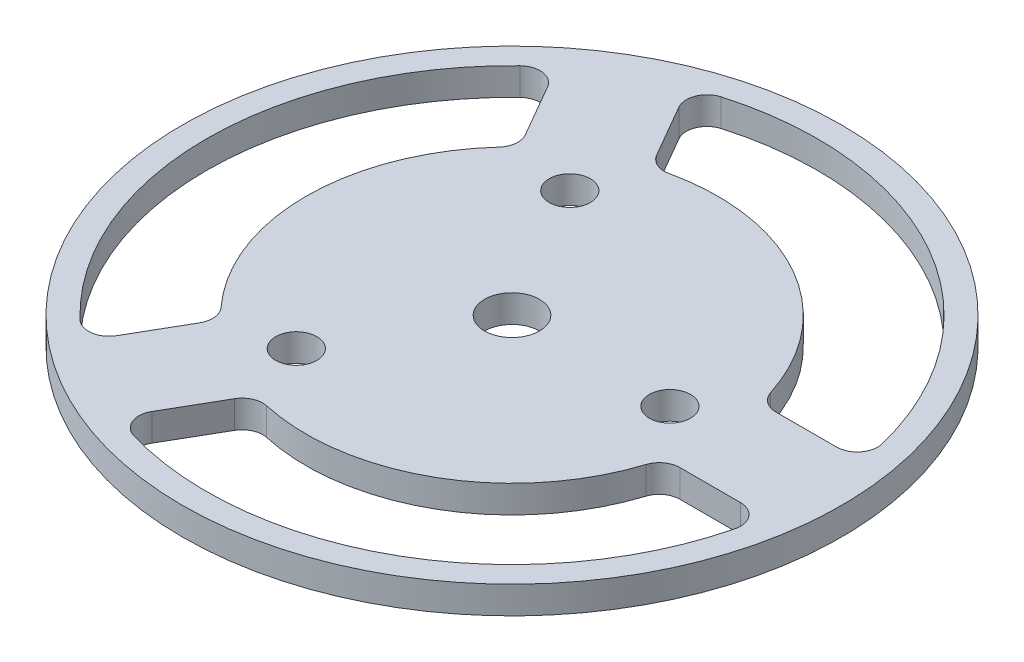
ISO-10303-21;
HEADER;
FILE_DESCRIPTION(('STEP AP214'),'2;1');
FILE_NAME('part.step','',(''),(''),'','','');
FILE_SCHEMA(('AUTOMOTIVE_DESIGN { 1 0 10303 214 1 1 1 1 }'));
ENDSEC;
DATA;
#1=APPLICATION_CONTEXT('core data for automotive mechanical design processes');
#2=APPLICATION_PROTOCOL_DEFINITION('international standard','automotive_design',2000,#1);
#3=PRODUCT_CONTEXT('',#1,'mechanical');
#4=PRODUCT('Part','Part','',(#3));
#5=PRODUCT_RELATED_PRODUCT_CATEGORY('part','',(#4));
#6=PRODUCT_DEFINITION_FORMATION('','',#4);
#7=PRODUCT_DEFINITION_CONTEXT('part definition',#1,'design');
#8=PRODUCT_DEFINITION('design','',#6,#7);
#9=PRODUCT_DEFINITION_SHAPE('','',#8);
#10=(LENGTH_UNIT() NAMED_UNIT(*) SI_UNIT(.MILLI.,.METRE.));
#11=(NAMED_UNIT(*) PLANE_ANGLE_UNIT() SI_UNIT($,.RADIAN.));
#12=(NAMED_UNIT(*) SI_UNIT($,.STERADIAN.) SOLID_ANGLE_UNIT());
#13=UNCERTAINTY_MEASURE_WITH_UNIT(LENGTH_MEASURE(1.E-05),#10,'distance_accuracy_value','');
#14=(GEOMETRIC_REPRESENTATION_CONTEXT(3) GLOBAL_UNCERTAINTY_ASSIGNED_CONTEXT((#13)) GLOBAL_UNIT_ASSIGNED_CONTEXT((#10,
#11,#12)) REPRESENTATION_CONTEXT('',''));
#15=CARTESIAN_POINT('',(0.,0.,0.));
#16=DIRECTION('',(0.,0.,1.));
#17=DIRECTION('',(1.,0.,0.));
#18=AXIS2_PLACEMENT_3D('',#15,#16,#17);
#19=CARTESIAN_POINT('',(0.,2.,0.));
#20=DIRECTION('',(0.,1.,0.));
#21=DIRECTION('',(0.,0.,-1.));
#22=AXIS2_PLACEMENT_3D('',#19,#20,#21);
#23=PLANE('',#22);
#24=CARTESIAN_POINT('',(0.,2.,0.));
#25=DIRECTION('',(0.,-1.,0.));
#26=DIRECTION('',(0.,0.,-1.));
#27=AXIS2_PLACEMENT_3D('',#24,#25,#26);
#28=CIRCLE('',#27,22.25);
#29=CARTESIAN_POINT('',(21.5943835085545,2.,5.36144578313253));
#30=VERTEX_POINT('',#29);
#31=CARTESIAN_POINT('',(-6.15404350507153,2.,21.3820075890382));
#32=VERTEX_POINT('',#31);
#33=EDGE_CURVE('E320',#30,#32,#28,.T.);
#34=ORIENTED_EDGE('',*,*,#33,.T.);
#35=CARTESIAN_POINT('',(-5.73916416765098,2.,19.9405239313502));
#36=DIRECTION('',(0.,-1.,0.));
#37=DIRECTION('',(0.,0.,-1.));
#38=AXIS2_PLACEMENT_3D('',#35,#36,#37);
#39=CIRCLE('',#38,1.5);
#40=CARTESIAN_POINT('',(-7.03820227332764,2.,19.1905239313502));
#41=VERTEX_POINT('',#40);
#42=EDGE_CURVE('E226',#41,#32,#39,.F.);
#43=ORIENTED_EDGE('',*,*,#42,.F.);
#44=DIRECTION('',(0.5,0.,-0.866025403784438));
#45=VECTOR('',#44,1.);
#46=CARTESIAN_POINT('',(-7.95540848128382,2.,20.7791716845479));
#47=LINE('',#46,#45);
#48=CARTESIAN_POINT('',(-4.83100368351267,2.,15.3675438313963));
#49=VERTEX_POINT('',#48);
#50=EDGE_CURVE('E323',#41,#49,#47,.T.);
#51=ORIENTED_EDGE('',*,*,#50,.T.);
#52=CARTESIAN_POINT('',(-3.53196557783601,2.,16.1175438313963));
#53=DIRECTION('',(0.,-1.,0.));
#54=DIRECTION('',(0.,0.,-1.));
#55=AXIS2_PLACEMENT_3D('',#52,#53,#54);
#56=CIRCLE('',#55,1.5);
#57=CARTESIAN_POINT('',(-3.21087779803273,2.,14.6523125739967));
#58=VERTEX_POINT('',#57);
#59=EDGE_CURVE('E254',#58,#49,#56,.F.);
#60=ORIENTED_EDGE('',*,*,#59,.F.);
#61=CARTESIAN_POINT('',(0.,2.,0.));
#62=DIRECTION('',(0.,1.,0.));
#63=DIRECTION('',(0.,0.,-1.));
#64=AXIS2_PLACEMENT_3D('',#61,#62,#63);
#65=CIRCLE('',#64,15.);
#66=CARTESIAN_POINT('',(14.2947138122876,2.,4.54545454545454));
#67=VERTEX_POINT('',#66);
#68=EDGE_CURVE('E326',#58,#67,#65,.T.);
#69=ORIENTED_EDGE('',*,*,#68,.T.);
#70=CARTESIAN_POINT('',(15.7241851935164,2.,5.));
#71=DIRECTION('',(0.,-1.,0.));
#72=DIRECTION('',(0.,0.,-1.));
#73=AXIS2_PLACEMENT_3D('',#70,#71,#72);
#74=CIRCLE('',#73,1.5);
#75=CARTESIAN_POINT('',(15.7241851935164,2.,3.5));
#76=VERTEX_POINT('',#75);
#77=EDGE_CURVE('E260',#76,#67,#74,.F.);
#78=ORIENTED_EDGE('',*,*,#77,.F.);
#79=DIRECTION('',(1.,0.,0.));
#80=VECTOR('',#79,1.);
#81=CARTESIAN_POINT('',(21.9729947890587,2.,3.5));
#82=LINE('',#81,#80);
#83=CARTESIAN_POINT('',(20.1385823731463,2.,3.5));
#84=VERTEX_POINT('',#83);
#85=EDGE_CURVE('E310',#76,#84,#82,.T.);
#86=ORIENTED_EDGE('',*,*,#85,.T.);
#87=CARTESIAN_POINT('',(20.1385823731463,2.,5.));
#88=DIRECTION('',(0.,-1.,0.));
#89=DIRECTION('',(0.,0.,-1.));
#90=AXIS2_PLACEMENT_3D('',#87,#88,#89);
#91=CIRCLE('',#90,1.5);
#92=EDGE_CURVE('E242',#30,#84,#91,.F.);
#93=ORIENTED_EDGE('',*,*,#92,.F.);
#94=EDGE_LOOP('',(#34,#43,#51,#60,#69,#78,#86,#93));
#95=FACE_BOUND('',#94,.T.);
#96=CARTESIAN_POINT('',(0.,2.,0.));
#97=DIRECTION('',(0.,-1.,0.));
#98=DIRECTION('',(0.,0.,-1.));
#99=AXIS2_PLACEMENT_3D('',#96,#97,#98);
#100=CIRCLE('',#99,22.25);
#101=CARTESIAN_POINT('',(-15.440340003483,2.,16.0205618059057));
#102=VERTEX_POINT('',#101);
#103=CARTESIAN_POINT('',(-15.440340003483,2.,-16.0205618059057));
#104=VERTEX_POINT('',#103);
#105=EDGE_CURVE('E319',#102,#104,#100,.T.);
#106=ORIENTED_EDGE('',*,*,#105,.T.);
#107=CARTESIAN_POINT('',(-14.3994182054954,2.,-14.9405239313502));
#108=DIRECTION('',(0.,-1.,0.));
#109=DIRECTION('',(0.,0.,-1.));
#110=AXIS2_PLACEMENT_3D('',#107,#108,#109);
#111=CIRCLE('',#110,1.5);
#112=CARTESIAN_POINT('',(-13.1003800998187,2.,-15.6905239313502));
#113=VERTEX_POINT('',#112);
#114=EDGE_CURVE('E248',#113,#104,#111,.F.);
#115=ORIENTED_EDGE('',*,*,#114,.F.);
#116=DIRECTION('',(0.499999999999999,0.,0.866025403784439));
#117=VECTOR('',#116,1.);
#118=CARTESIAN_POINT('',(-14.0175863077749,2.,-17.2791716845479));
#119=LINE('',#118,#117);
#120=CARTESIAN_POINT('',(-10.8931815100037,2.,-11.8675438313963));
#121=VERTEX_POINT('',#120);
#122=EDGE_CURVE('E302',#113,#121,#119,.T.);
#123=ORIENTED_EDGE('',*,*,#122,.T.);
#124=CARTESIAN_POINT('',(-12.1922196156804,2.,-11.1175438313963));
#125=DIRECTION('',(0.,-1.,0.));
#126=DIRECTION('',(0.,0.,-1.));
#127=AXIS2_PLACEMENT_3D('',#124,#125,#126);
#128=CIRCLE('',#127,1.5);
#129=CARTESIAN_POINT('',(-11.0838360142549,2.,-10.1068580285421));
#130=VERTEX_POINT('',#129);
#131=EDGE_CURVE('E277',#130,#121,#128,.F.);
#132=ORIENTED_EDGE('',*,*,#131,.F.);
#133=CARTESIAN_POINT('',(0.,2.,0.));
#134=DIRECTION('',(0.,1.,0.));
#135=DIRECTION('',(0.,0.,-1.));
#136=AXIS2_PLACEMENT_3D('',#133,#134,#135);
#137=CIRCLE('',#136,15.);
#138=CARTESIAN_POINT('',(-11.0838360142549,2.,10.1068580285421));
#139=VERTEX_POINT('',#138);
#140=EDGE_CURVE('E297',#130,#139,#137,.T.);
#141=ORIENTED_EDGE('',*,*,#140,.T.);
#142=CARTESIAN_POINT('',(-12.1922196156804,2.,11.1175438313963));
#143=DIRECTION('',(0.,-1.,0.));
#144=DIRECTION('',(0.,0.,-1.));
#145=AXIS2_PLACEMENT_3D('',#142,#143,#144);
#146=CIRCLE('',#145,1.5);
#147=CARTESIAN_POINT('',(-10.8931815100037,2.,11.8675438313963));
#148=VERTEX_POINT('',#147);
#149=EDGE_CURVE('E283',#148,#139,#146,.F.);
#150=ORIENTED_EDGE('',*,*,#149,.F.);
#151=DIRECTION('',(-0.499999999999998,0.,0.86602540378444));
#152=VECTOR('',#151,1.);
#153=CARTESIAN_POINT('',(-14.0175863077749,2.,17.2791716845479));
#154=LINE('',#153,#152);
#155=CARTESIAN_POINT('',(-13.1003800998187,2.,15.6905239313502));
#156=VERTEX_POINT('',#155);
#157=EDGE_CURVE('E294',#148,#156,#154,.T.);
#158=ORIENTED_EDGE('',*,*,#157,.T.);
#159=CARTESIAN_POINT('',(-14.3994182054954,2.,14.9405239313502));
#160=DIRECTION('',(0.,-1.,0.));
#161=DIRECTION('',(0.,0.,-1.));
#162=AXIS2_PLACEMENT_3D('',#159,#160,#161);
#163=CIRCLE('',#162,1.5);
#164=EDGE_CURVE('E45',#102,#156,#163,.F.);
#165=ORIENTED_EDGE('',*,*,#164,.F.);
#166=EDGE_LOOP('',(#106,#115,#123,#132,#141,#150,#158,#165));
#167=FACE_BOUND('',#166,.T.);
#168=CARTESIAN_POINT('',(0.,2.,0.));
#169=DIRECTION('',(0.,-1.,0.));
#170=DIRECTION('',(0.,0.,-1.));
#171=AXIS2_PLACEMENT_3D('',#168,#169,#170);
#172=CIRCLE('',#171,22.25);
#173=CARTESIAN_POINT('',(-6.15404350507152,2.,-21.3820075890382));
#174=VERTEX_POINT('',#173);
#175=CARTESIAN_POINT('',(21.5943835085545,2.,-5.36144578313253));
#176=VERTEX_POINT('',#175);
#177=EDGE_CURVE('E342',#174,#176,#172,.T.);
#178=ORIENTED_EDGE('',*,*,#177,.T.);
#179=CARTESIAN_POINT('',(20.1385823731463,2.,-5.));
#180=DIRECTION('',(0.,-1.,0.));
#181=DIRECTION('',(0.,0.,-1.));
#182=AXIS2_PLACEMENT_3D('',#179,#180,#181);
#183=CIRCLE('',#182,1.5);
#184=CARTESIAN_POINT('',(20.1385823731463,2.,-3.5));
#185=VERTEX_POINT('',#184);
#186=EDGE_CURVE('E271',#185,#176,#183,.F.);
#187=ORIENTED_EDGE('',*,*,#186,.F.);
#188=DIRECTION('',(-1.,0.,0.));
#189=VECTOR('',#188,1.);
#190=CARTESIAN_POINT('',(21.9729947890587,2.,-3.5));
#191=LINE('',#190,#189);
#192=CARTESIAN_POINT('',(15.7241851935164,2.,-3.5));
#193=VERTEX_POINT('',#192);
#194=EDGE_CURVE('E344',#185,#193,#191,.T.);
#195=ORIENTED_EDGE('',*,*,#194,.T.);
#196=CARTESIAN_POINT('',(15.7241851935164,2.,-5.));
#197=DIRECTION('',(0.,-1.,0.));
#198=DIRECTION('',(0.,0.,-1.));
#199=AXIS2_PLACEMENT_3D('',#196,#197,#198);
#200=CIRCLE('',#199,1.5);
#201=CARTESIAN_POINT('',(14.2947138122876,2.,-4.54545454545454));
#202=VERTEX_POINT('',#201);
#203=EDGE_CURVE('E236',#202,#193,#200,.F.);
#204=ORIENTED_EDGE('',*,*,#203,.F.);
#205=CARTESIAN_POINT('',(0.,2.,0.));
#206=DIRECTION('',(0.,1.,0.));
#207=DIRECTION('',(0.,0.,-1.));
#208=AXIS2_PLACEMENT_3D('',#205,#206,#207);
#209=CIRCLE('',#208,15.);
#210=CARTESIAN_POINT('',(-3.21087779803272,2.,-14.6523125739967));
#211=VERTEX_POINT('',#210);
#212=EDGE_CURVE('E219',#202,#211,#209,.T.);
#213=ORIENTED_EDGE('',*,*,#212,.T.);
#214=CARTESIAN_POINT('',(-3.531965577836,2.,-16.1175438313963));
#215=DIRECTION('',(0.,-1.,0.));
#216=DIRECTION('',(0.,0.,-1.));
#217=AXIS2_PLACEMENT_3D('',#214,#215,#216);
#218=CIRCLE('',#217,1.5);
#219=CARTESIAN_POINT('',(-4.83100368351266,2.,-15.3675438313963));
#220=VERTEX_POINT('',#219);
#221=EDGE_CURVE('E202',#220,#211,#218,.F.);
#222=ORIENTED_EDGE('',*,*,#221,.F.);
#223=DIRECTION('',(-0.5,0.,-0.866025403784439));
#224=VECTOR('',#223,1.);
#225=CARTESIAN_POINT('',(-7.9554084812838,2.,-20.7791716845479));
#226=LINE('',#225,#224);
#227=CARTESIAN_POINT('',(-7.03820227332762,2.,-19.1905239313502));
#228=VERTEX_POINT('',#227);
#229=EDGE_CURVE('E213',#220,#228,#226,.T.);
#230=ORIENTED_EDGE('',*,*,#229,.T.);
#231=CARTESIAN_POINT('',(-5.73916416765096,2.,-19.9405239313502));
#232=DIRECTION('',(0.,-1.,0.));
#233=DIRECTION('',(0.,0.,-1.));
#234=AXIS2_PLACEMENT_3D('',#231,#232,#233);
#235=CIRCLE('',#234,1.5);
#236=EDGE_CURVE('E266',#174,#228,#235,.F.);
#237=ORIENTED_EDGE('',*,*,#236,.F.);
#238=EDGE_LOOP('',(#178,#187,#195,#204,#213,#222,#230,#237));
#239=FACE_BOUND('',#238,.T.);
#240=CARTESIAN_POINT('',(-5.75000000000005,2.,-9.95929214352102));
#241=DIRECTION('',(0.,-1.,0.));
#242=DIRECTION('',(0.,0.,-1.));
#243=AXIS2_PLACEMENT_3D('',#240,#241,#242);
#244=CIRCLE('',#243,1.5);
#245=CARTESIAN_POINT('',(-5.75000000000005,2.,-11.459292143521));
#246=VERTEX_POINT('',#245);
#247=EDGE_CURVE('E355',#246,#246,#244,.T.);
#248=ORIENTED_EDGE('',*,*,#247,.T.);
#249=EDGE_LOOP('',(#248));
#250=FACE_BOUND('',#249,.T.);
#251=CARTESIAN_POINT('',(0.,2.,0.));
#252=DIRECTION('',(0.,-1.,0.));
#253=DIRECTION('',(0.,0.,-1.));
#254=AXIS2_PLACEMENT_3D('',#251,#252,#253);
#255=CIRCLE('',#254,2.);
#256=CARTESIAN_POINT('',(0.,2.,-2.));
#257=VERTEX_POINT('',#256);
#258=EDGE_CURVE('E367',#257,#257,#255,.T.);
#259=ORIENTED_EDGE('',*,*,#258,.T.);
#260=EDGE_LOOP('',(#259));
#261=FACE_BOUND('',#260,.T.);
#262=CARTESIAN_POINT('',(0.,2.,0.));
#263=DIRECTION('',(0.,-1.,0.));
#264=DIRECTION('',(0.,0.,-1.));
#265=AXIS2_PLACEMENT_3D('',#262,#263,#264);
#266=CIRCLE('',#265,24.);
#267=CARTESIAN_POINT('',(0.,2.,-24.));
#268=VERTEX_POINT('',#267);
#269=EDGE_CURVE('E373',#268,#268,#266,.T.);
#270=ORIENTED_EDGE('',*,*,#269,.F.);
#271=EDGE_LOOP('',(#270));
#272=FACE_BOUND('',#271,.T.);
#273=CARTESIAN_POINT('',(11.5,2.,0.));
#274=DIRECTION('',(0.,-1.,0.));
#275=DIRECTION('',(0.,0.,-1.));
#276=AXIS2_PLACEMENT_3D('',#273,#274,#275);
#277=CIRCLE('',#276,1.5);
#278=CARTESIAN_POINT('',(11.5,2.,-1.5));
#279=VERTEX_POINT('',#278);
#280=EDGE_CURVE('E361',#279,#279,#277,.T.);
#281=ORIENTED_EDGE('',*,*,#280,.T.);
#282=EDGE_LOOP('',(#281));
#283=FACE_BOUND('',#282,.T.);
#284=CARTESIAN_POINT('',(-5.74999999999991,2.,9.95929214352109));
#285=DIRECTION('',(0.,-1.,0.));
#286=DIRECTION('',(0.,0.,-1.));
#287=AXIS2_PLACEMENT_3D('',#284,#285,#286);
#288=CIRCLE('',#287,1.5);
#289=CARTESIAN_POINT('',(-5.74999999999991,2.,8.4592921435211));
#290=VERTEX_POINT('',#289);
#291=EDGE_CURVE('E349',#290,#290,#288,.T.);
#292=ORIENTED_EDGE('',*,*,#291,.T.);
#293=EDGE_LOOP('',(#292));
#294=FACE_BOUND('',#293,.T.);
#295=ADVANCED_FACE('F37',(#95,#167,#239,#250,#261,#272,#283,#294),#23,.T.);
#296=CARTESIAN_POINT('',(0.,0.,0.));
#297=DIRECTION('',(0.,1.,0.));
#298=DIRECTION('',(0.,0.,-1.));
#299=AXIS2_PLACEMENT_3D('',#296,#297,#298);
#300=PLANE('',#299);
#301=CARTESIAN_POINT('',(0.,0.,0.));
#302=DIRECTION('',(0.,1.,0.));
#303=DIRECTION('',(0.,0.,-1.));
#304=AXIS2_PLACEMENT_3D('',#301,#302,#303);
#305=CIRCLE('',#304,15.);
#306=CARTESIAN_POINT('',(-3.21087779803273,0.,14.6523125739967));
#307=VERTEX_POINT('',#306);
#308=CARTESIAN_POINT('',(14.2947138122876,0.,4.54545454545454));
#309=VERTEX_POINT('',#308);
#310=EDGE_CURVE('E313',#307,#309,#305,.T.);
#311=ORIENTED_EDGE('',*,*,#310,.F.);
#312=CARTESIAN_POINT('',(-3.53196557783601,0.,16.1175438313963));
#313=DIRECTION('',(0.,-1.,0.));
#314=DIRECTION('',(0.,0.,-1.));
#315=AXIS2_PLACEMENT_3D('',#312,#313,#314);
#316=CIRCLE('',#315,1.5);
#317=CARTESIAN_POINT('',(-4.83100368351267,0.,15.3675438313963));
#318=VERTEX_POINT('',#317);
#319=EDGE_CURVE('E257',#318,#307,#316,.T.);
#320=ORIENTED_EDGE('',*,*,#319,.F.);
#321=DIRECTION('',(0.5,0.,-0.866025403784438));
#322=VECTOR('',#321,1.);
#323=CARTESIAN_POINT('',(-7.95540848128382,0.,20.7791716845479));
#324=LINE('',#323,#322);
#325=CARTESIAN_POINT('',(-7.03820227332764,0.,19.1905239313502));
#326=VERTEX_POINT('',#325);
#327=EDGE_CURVE('E309',#326,#318,#324,.T.);
#328=ORIENTED_EDGE('',*,*,#327,.F.);
#329=CARTESIAN_POINT('',(-5.73916416765098,0.,19.9405239313502));
#330=DIRECTION('',(0.,-1.,0.));
#331=DIRECTION('',(0.,0.,-1.));
#332=AXIS2_PLACEMENT_3D('',#329,#330,#331);
#333=CIRCLE('',#332,1.5);
#334=CARTESIAN_POINT('',(-6.15404350507153,0.,21.3820075890382));
#335=VERTEX_POINT('',#334);
#336=EDGE_CURVE('E233',#335,#326,#333,.T.);
#337=ORIENTED_EDGE('',*,*,#336,.F.);
#338=CARTESIAN_POINT('',(0.,0.,0.));
#339=DIRECTION('',(0.,-1.,0.));
#340=DIRECTION('',(0.,0.,-1.));
#341=AXIS2_PLACEMENT_3D('',#338,#339,#340);
#342=CIRCLE('',#341,22.25);
#343=CARTESIAN_POINT('',(21.5943835085545,0.,5.36144578313253));
#344=VERTEX_POINT('',#343);
#345=EDGE_CURVE('E306',#344,#335,#342,.T.);
#346=ORIENTED_EDGE('',*,*,#345,.F.);
#347=CARTESIAN_POINT('',(20.1385823731463,0.,5.));
#348=DIRECTION('',(0.,-1.,0.));
#349=DIRECTION('',(0.,0.,-1.));
#350=AXIS2_PLACEMENT_3D('',#347,#348,#349);
#351=CIRCLE('',#350,1.5);
#352=CARTESIAN_POINT('',(20.1385823731463,0.,3.5));
#353=VERTEX_POINT('',#352);
#354=EDGE_CURVE('E245',#353,#344,#351,.T.);
#355=ORIENTED_EDGE('',*,*,#354,.F.);
#356=DIRECTION('',(1.,0.,0.));
#357=VECTOR('',#356,1.);
#358=CARTESIAN_POINT('',(21.9729947890587,0.,3.5));
#359=LINE('',#358,#357);
#360=CARTESIAN_POINT('',(15.7241851935164,0.,3.5));
#361=VERTEX_POINT('',#360);
#362=EDGE_CURVE('E316',#361,#353,#359,.T.);
#363=ORIENTED_EDGE('',*,*,#362,.F.);
#364=CARTESIAN_POINT('',(15.7241851935164,0.,5.));
#365=DIRECTION('',(0.,-1.,0.));
#366=DIRECTION('',(0.,0.,-1.));
#367=AXIS2_PLACEMENT_3D('',#364,#365,#366);
#368=CIRCLE('',#367,1.5);
#369=EDGE_CURVE('E263',#309,#361,#368,.T.);
#370=ORIENTED_EDGE('',*,*,#369,.F.);
#371=EDGE_LOOP('',(#311,#320,#328,#337,#346,#355,#363,#370));
#372=FACE_BOUND('',#371,.T.);
#373=CARTESIAN_POINT('',(0.,0.,0.));
#374=DIRECTION('',(0.,1.,0.));
#375=DIRECTION('',(0.,0.,-1.));
#376=AXIS2_PLACEMENT_3D('',#373,#374,#375);
#377=CIRCLE('',#376,15.);
#378=CARTESIAN_POINT('',(-11.0838360142549,0.,-10.1068580285421));
#379=VERTEX_POINT('',#378);
#380=CARTESIAN_POINT('',(-11.0838360142549,0.,10.1068580285421));
#381=VERTEX_POINT('',#380);
#382=EDGE_CURVE('E432',#379,#381,#377,.T.);
#383=ORIENTED_EDGE('',*,*,#382,.F.);
#384=CARTESIAN_POINT('',(-12.1922196156804,0.,-11.1175438313963));
#385=DIRECTION('',(0.,-1.,0.));
#386=DIRECTION('',(0.,0.,-1.));
#387=AXIS2_PLACEMENT_3D('',#384,#385,#386);
#388=CIRCLE('',#387,1.5);
#389=CARTESIAN_POINT('',(-10.8931815100037,0.,-11.8675438313963));
#390=VERTEX_POINT('',#389);
#391=EDGE_CURVE('E280',#390,#379,#388,.T.);
#392=ORIENTED_EDGE('',*,*,#391,.F.);
#393=DIRECTION('',(0.499999999999999,0.,0.866025403784439));
#394=VECTOR('',#393,1.);
#395=CARTESIAN_POINT('',(-14.0175863077749,0.,-17.2791716845479));
#396=LINE('',#395,#394);
#397=CARTESIAN_POINT('',(-13.1003800998187,0.,-15.6905239313502));
#398=VERTEX_POINT('',#397);
#399=EDGE_CURVE('E300',#398,#390,#396,.T.);
#400=ORIENTED_EDGE('',*,*,#399,.F.);
#401=CARTESIAN_POINT('',(-14.3994182054954,0.,-14.9405239313502));
#402=DIRECTION('',(0.,-1.,0.));
#403=DIRECTION('',(0.,0.,-1.));
#404=AXIS2_PLACEMENT_3D('',#401,#402,#403);
#405=CIRCLE('',#404,1.5);
#406=CARTESIAN_POINT('',(-15.440340003483,0.,-16.0205618059057));
#407=VERTEX_POINT('',#406);
#408=EDGE_CURVE('E251',#407,#398,#405,.T.);
#409=ORIENTED_EDGE('',*,*,#408,.F.);
#410=CARTESIAN_POINT('',(0.,0.,0.));
#411=DIRECTION('',(0.,-1.,0.));
#412=DIRECTION('',(0.,0.,-1.));
#413=AXIS2_PLACEMENT_3D('',#410,#411,#412);
#414=CIRCLE('',#413,22.25);
#415=CARTESIAN_POINT('',(-15.440340003483,0.,16.0205618059057));
#416=VERTEX_POINT('',#415);
#417=EDGE_CURVE('E296',#416,#407,#414,.T.);
#418=ORIENTED_EDGE('',*,*,#417,.F.);
#419=CARTESIAN_POINT('',(-14.3994182054954,0.,14.9405239313502));
#420=DIRECTION('',(0.,-1.,0.));
#421=DIRECTION('',(0.,0.,-1.));
#422=AXIS2_PLACEMENT_3D('',#419,#420,#421);
#423=CIRCLE('',#422,1.5);
#424=CARTESIAN_POINT('',(-13.1003800998187,0.,15.6905239313502));
#425=VERTEX_POINT('',#424);
#426=EDGE_CURVE('E11',#425,#416,#423,.T.);
#427=ORIENTED_EDGE('',*,*,#426,.F.);
#428=DIRECTION('',(-0.499999999999998,0.,0.86602540378444));
#429=VECTOR('',#428,1.);
#430=CARTESIAN_POINT('',(-14.0175863077749,0.,17.2791716845479));
#431=LINE('',#430,#429);
#432=CARTESIAN_POINT('',(-10.8931815100037,0.,11.8675438313963));
#433=VERTEX_POINT('',#432);
#434=EDGE_CURVE('E345',#433,#425,#431,.T.);
#435=ORIENTED_EDGE('',*,*,#434,.F.);
#436=CARTESIAN_POINT('',(-12.1922196156804,0.,11.1175438313963));
#437=DIRECTION('',(0.,-1.,0.));
#438=DIRECTION('',(0.,0.,-1.));
#439=AXIS2_PLACEMENT_3D('',#436,#437,#438);
#440=CIRCLE('',#439,1.5);
#441=EDGE_CURVE('E286',#381,#433,#440,.T.);
#442=ORIENTED_EDGE('',*,*,#441,.F.);
#443=EDGE_LOOP('',(#383,#392,#400,#409,#418,#427,#435,#442));
#444=FACE_BOUND('',#443,.T.);
#445=CARTESIAN_POINT('',(0.,0.,0.));
#446=DIRECTION('',(0.,1.,0.));
#447=DIRECTION('',(0.,0.,-1.));
#448=AXIS2_PLACEMENT_3D('',#445,#446,#447);
#449=CIRCLE('',#448,15.);
#450=CARTESIAN_POINT('',(14.2947138122876,0.,-4.54545454545454));
#451=VERTEX_POINT('',#450);
#452=CARTESIAN_POINT('',(-3.21087779803272,0.,-14.6523125739967));
#453=VERTEX_POINT('',#452);
#454=EDGE_CURVE('E336',#451,#453,#449,.T.);
#455=ORIENTED_EDGE('',*,*,#454,.F.);
#456=CARTESIAN_POINT('',(15.7241851935164,0.,-5.));
#457=DIRECTION('',(0.,-1.,0.));
#458=DIRECTION('',(0.,0.,-1.));
#459=AXIS2_PLACEMENT_3D('',#456,#457,#458);
#460=CIRCLE('',#459,1.5);
#461=CARTESIAN_POINT('',(15.7241851935164,0.,-3.5));
#462=VERTEX_POINT('',#461);
#463=EDGE_CURVE('E239',#462,#451,#460,.T.);
#464=ORIENTED_EDGE('',*,*,#463,.F.);
#465=DIRECTION('',(-1.,0.,0.));
#466=VECTOR('',#465,1.);
#467=CARTESIAN_POINT('',(21.9729947890587,0.,-3.5));
#468=LINE('',#467,#466);
#469=CARTESIAN_POINT('',(20.1385823731463,0.,-3.5));
#470=VERTEX_POINT('',#469);
#471=EDGE_CURVE('E333',#470,#462,#468,.T.);
#472=ORIENTED_EDGE('',*,*,#471,.F.);
#473=CARTESIAN_POINT('',(20.1385823731463,0.,-5.));
#474=DIRECTION('',(0.,-1.,0.));
#475=DIRECTION('',(0.,0.,-1.));
#476=AXIS2_PLACEMENT_3D('',#473,#474,#475);
#477=CIRCLE('',#476,1.5);
#478=CARTESIAN_POINT('',(21.5943835085545,0.,-5.36144578313253));
#479=VERTEX_POINT('',#478);
#480=EDGE_CURVE('E274',#479,#470,#477,.T.);
#481=ORIENTED_EDGE('',*,*,#480,.F.);
#482=CARTESIAN_POINT('',(0.,0.,0.));
#483=DIRECTION('',(0.,-1.,0.));
#484=DIRECTION('',(0.,0.,-1.));
#485=AXIS2_PLACEMENT_3D('',#482,#483,#484);
#486=CIRCLE('',#485,22.25);
#487=CARTESIAN_POINT('',(-6.15404350507152,0.,-21.3820075890382));
#488=VERTEX_POINT('',#487);
#489=EDGE_CURVE('E218',#488,#479,#486,.T.);
#490=ORIENTED_EDGE('',*,*,#489,.F.);
#491=CARTESIAN_POINT('',(-5.73916416765096,0.,-19.9405239313502));
#492=DIRECTION('',(0.,-1.,0.));
#493=DIRECTION('',(0.,0.,-1.));
#494=AXIS2_PLACEMENT_3D('',#491,#492,#493);
#495=CIRCLE('',#494,1.5);
#496=CARTESIAN_POINT('',(-7.03820227332762,0.,-19.1905239313502));
#497=VERTEX_POINT('',#496);
#498=EDGE_CURVE('E268',#497,#488,#495,.T.);
#499=ORIENTED_EDGE('',*,*,#498,.F.);
#500=DIRECTION('',(-0.5,0.,-0.866025403784439));
#501=VECTOR('',#500,1.);
#502=CARTESIAN_POINT('',(-7.9554084812838,0.,-20.7791716845479));
#503=LINE('',#502,#501);
#504=CARTESIAN_POINT('',(-4.83100368351266,0.,-15.3675438313963));
#505=VERTEX_POINT('',#504);
#506=EDGE_CURVE('E339',#505,#497,#503,.T.);
#507=ORIENTED_EDGE('',*,*,#506,.F.);
#508=CARTESIAN_POINT('',(-3.531965577836,0.,-16.1175438313963));
#509=DIRECTION('',(0.,-1.,0.));
#510=DIRECTION('',(0.,0.,-1.));
#511=AXIS2_PLACEMENT_3D('',#508,#509,#510);
#512=CIRCLE('',#511,1.5);
#513=EDGE_CURVE('E205',#453,#505,#512,.T.);
#514=ORIENTED_EDGE('',*,*,#513,.F.);
#515=EDGE_LOOP('',(#455,#464,#472,#481,#490,#499,#507,#514));
#516=FACE_BOUND('',#515,.T.);
#517=CARTESIAN_POINT('',(0.,0.,0.));
#518=DIRECTION('',(0.,-1.,0.));
#519=DIRECTION('',(0.,0.,-1.));
#520=AXIS2_PLACEMENT_3D('',#517,#518,#519);
#521=CIRCLE('',#520,24.);
#522=CARTESIAN_POINT('',(0.,0.,-24.));
#523=VERTEX_POINT('',#522);
#524=EDGE_CURVE('E370',#523,#523,#521,.T.);
#525=ORIENTED_EDGE('',*,*,#524,.T.);
#526=EDGE_LOOP('',(#525));
#527=FACE_BOUND('',#526,.T.);
#528=CARTESIAN_POINT('',(0.,0.,0.));
#529=DIRECTION('',(0.,-1.,0.));
#530=DIRECTION('',(0.,0.,-1.));
#531=AXIS2_PLACEMENT_3D('',#528,#529,#530);
#532=CIRCLE('',#531,2.);
#533=CARTESIAN_POINT('',(0.,0.,-2.));
#534=VERTEX_POINT('',#533);
#535=EDGE_CURVE('E364',#534,#534,#532,.T.);
#536=ORIENTED_EDGE('',*,*,#535,.F.);
#537=EDGE_LOOP('',(#536));
#538=FACE_BOUND('',#537,.T.);
#539=CARTESIAN_POINT('',(11.5,0.,0.));
#540=DIRECTION('',(0.,-1.,0.));
#541=DIRECTION('',(0.,0.,-1.));
#542=AXIS2_PLACEMENT_3D('',#539,#540,#541);
#543=CIRCLE('',#542,1.5);
#544=CARTESIAN_POINT('',(11.5,0.,-1.5));
#545=VERTEX_POINT('',#544);
#546=EDGE_CURVE('E358',#545,#545,#543,.T.);
#547=ORIENTED_EDGE('',*,*,#546,.F.);
#548=EDGE_LOOP('',(#547));
#549=FACE_BOUND('',#548,.T.);
#550=CARTESIAN_POINT('',(-5.75000000000005,0.,-9.95929214352102));
#551=DIRECTION('',(0.,-1.,0.));
#552=DIRECTION('',(0.,0.,-1.));
#553=AXIS2_PLACEMENT_3D('',#550,#551,#552);
#554=CIRCLE('',#553,1.5);
#555=CARTESIAN_POINT('',(-5.75000000000005,0.,-11.459292143521));
#556=VERTEX_POINT('',#555);
#557=EDGE_CURVE('E352',#556,#556,#554,.T.);
#558=ORIENTED_EDGE('',*,*,#557,.F.);
#559=EDGE_LOOP('',(#558));
#560=FACE_BOUND('',#559,.T.);
#561=CARTESIAN_POINT('',(-5.74999999999991,0.,9.95929214352109));
#562=DIRECTION('',(0.,-1.,0.));
#563=DIRECTION('',(0.,0.,-1.));
#564=AXIS2_PLACEMENT_3D('',#561,#562,#563);
#565=CIRCLE('',#564,1.5);
#566=CARTESIAN_POINT('',(-5.74999999999991,0.,8.4592921435211));
#567=VERTEX_POINT('',#566);
#568=EDGE_CURVE('E341',#567,#567,#565,.T.);
#569=ORIENTED_EDGE('',*,*,#568,.F.);
#570=EDGE_LOOP('',(#569));
#571=FACE_BOUND('',#570,.T.);
#572=ADVANCED_FACE('F439',(#372,#444,#516,#527,#538,#549,#560,#571),#300,.F.);
#573=CARTESIAN_POINT('',(0.,2.,0.));
#574=DIRECTION('',(0.,-1.,0.));
#575=DIRECTION('',(0.,0.,1.));
#576=AXIS2_PLACEMENT_3D('',#573,#574,#575);
#577=CYLINDRICAL_SURFACE('',#576,24.);
#578=ORIENTED_EDGE('',*,*,#269,.T.);
#579=EDGE_LOOP('',(#578));
#580=FACE_BOUND('',#579,.T.);
#581=ORIENTED_EDGE('',*,*,#524,.F.);
#582=EDGE_LOOP('',(#581));
#583=FACE_BOUND('',#582,.T.);
#584=ADVANCED_FACE('F459',(#580,#583),#577,.T.);
#585=CARTESIAN_POINT('',(0.,2.,0.));
#586=DIRECTION('',(0.,-1.,0.));
#587=DIRECTION('',(0.,0.,1.));
#588=AXIS2_PLACEMENT_3D('',#585,#586,#587);
#589=CYLINDRICAL_SURFACE('',#588,2.);
#590=ORIENTED_EDGE('',*,*,#258,.F.);
#591=EDGE_LOOP('',(#590));
#592=FACE_BOUND('',#591,.T.);
#593=ORIENTED_EDGE('',*,*,#535,.T.);
#594=EDGE_LOOP('',(#593));
#595=FACE_BOUND('',#594,.T.);
#596=ADVANCED_FACE('F463',(#592,#595),#589,.F.);
#597=CARTESIAN_POINT('',(11.5,2.,0.));
#598=DIRECTION('',(0.,-1.,0.));
#599=DIRECTION('',(0.,0.,1.));
#600=AXIS2_PLACEMENT_3D('',#597,#598,#599);
#601=CYLINDRICAL_SURFACE('',#600,1.5);
#602=ORIENTED_EDGE('',*,*,#280,.F.);
#603=EDGE_LOOP('',(#602));
#604=FACE_BOUND('',#603,.T.);
#605=ORIENTED_EDGE('',*,*,#546,.T.);
#606=EDGE_LOOP('',(#605));
#607=FACE_BOUND('',#606,.T.);
#608=ADVANCED_FACE('F539',(#604,#607),#601,.F.);
#609=CARTESIAN_POINT('',(-5.75000000000005,2.,-9.95929214352102));
#610=DIRECTION('',(0.,-1.,0.));
#611=DIRECTION('',(0.,0.,1.));
#612=AXIS2_PLACEMENT_3D('',#609,#610,#611);
#613=CYLINDRICAL_SURFACE('',#612,1.5);
#614=ORIENTED_EDGE('',*,*,#247,.F.);
#615=EDGE_LOOP('',(#614));
#616=FACE_BOUND('',#615,.T.);
#617=ORIENTED_EDGE('',*,*,#557,.T.);
#618=EDGE_LOOP('',(#617));
#619=FACE_BOUND('',#618,.T.);
#620=ADVANCED_FACE('F536',(#616,#619),#613,.F.);
#621=CARTESIAN_POINT('',(-5.74999999999991,2.,9.95929214352109));
#622=DIRECTION('',(0.,-1.,0.));
#623=DIRECTION('',(0.,0.,1.));
#624=AXIS2_PLACEMENT_3D('',#621,#622,#623);
#625=CYLINDRICAL_SURFACE('',#624,1.5);
#626=ORIENTED_EDGE('',*,*,#291,.F.);
#627=EDGE_LOOP('',(#626));
#628=FACE_BOUND('',#627,.T.);
#629=ORIENTED_EDGE('',*,*,#568,.T.);
#630=EDGE_LOOP('',(#629));
#631=FACE_BOUND('',#630,.T.);
#632=ADVANCED_FACE('F533',(#628,#631),#625,.F.);
#633=CARTESIAN_POINT('',(0.,0.,0.));
#634=DIRECTION('',(0.,1.,0.));
#635=DIRECTION('',(0.,0.,-1.));
#636=AXIS2_PLACEMENT_3D('',#633,#634,#635);
#637=CYLINDRICAL_SURFACE('',#636,22.25);
#638=ORIENTED_EDGE('',*,*,#489,.T.);
#639=DIRECTION('',(0.,1.,0.));
#640=VECTOR('',#639,1.);
#641=CARTESIAN_POINT('',(21.5943835085545,0.,-5.36144578313253));
#642=LINE('',#641,#640);
#643=EDGE_CURVE('E409',#176,#479,#642,.F.);
#644=ORIENTED_EDGE('',*,*,#643,.F.);
#645=ORIENTED_EDGE('',*,*,#177,.F.);
#646=DIRECTION('',(0.,1.,0.));
#647=VECTOR('',#646,1.);
#648=CARTESIAN_POINT('',(-6.15404350507151,0.,-21.3820075890382));
#649=LINE('',#648,#647);
#650=EDGE_CURVE('E411',#488,#174,#649,.T.);
#651=ORIENTED_EDGE('',*,*,#650,.F.);
#652=EDGE_LOOP('',(#638,#644,#645,#651));
#653=FACE_BOUND('',#652,.T.);
#654=ADVANCED_FACE('F516',(#653),#637,.F.);
#655=CARTESIAN_POINT('',(-7.9554084812838,0.,-20.7791716845479));
#656=DIRECTION('',(-0.866025403784439,0.,0.5));
#657=DIRECTION('',(-0.5,0.,-0.866025403784439));
#658=AXIS2_PLACEMENT_3D('',#655,#656,#657);
#659=PLANE('',#658);
#660=ORIENTED_EDGE('',*,*,#506,.T.);
#661=DIRECTION('',(0.,-1.,0.));
#662=VECTOR('',#661,1.);
#663=CARTESIAN_POINT('',(-7.03820227332762,0.,-19.1905239313502));
#664=LINE('',#663,#662);
#665=EDGE_CURVE('E210',#228,#497,#664,.T.);
#666=ORIENTED_EDGE('',*,*,#665,.F.);
#667=ORIENTED_EDGE('',*,*,#229,.F.);
#668=DIRECTION('',(0.,-1.,0.));
#669=VECTOR('',#668,1.);
#670=CARTESIAN_POINT('',(-4.83100368351266,2.,-15.3675438313963));
#671=LINE('',#670,#669);
#672=EDGE_CURVE('E198',#505,#220,#671,.F.);
#673=ORIENTED_EDGE('',*,*,#672,.F.);
#674=EDGE_LOOP('',(#660,#666,#667,#673));
#675=FACE_BOUND('',#674,.T.);
#676=ADVANCED_FACE('F214',(#675),#659,.F.);
#677=CARTESIAN_POINT('',(0.,0.,0.));
#678=DIRECTION('',(0.,1.,0.));
#679=DIRECTION('',(0.,0.,-1.));
#680=AXIS2_PLACEMENT_3D('',#677,#678,#679);
#681=CYLINDRICAL_SURFACE('',#680,15.);
#682=ORIENTED_EDGE('',*,*,#212,.F.);
#683=DIRECTION('',(0.,1.,0.));
#684=VECTOR('',#683,1.);
#685=CARTESIAN_POINT('',(14.2947138122876,0.,-4.54545454545454));
#686=LINE('',#685,#684);
#687=EDGE_CURVE('E209',#451,#202,#686,.T.);
#688=ORIENTED_EDGE('',*,*,#687,.F.);
#689=ORIENTED_EDGE('',*,*,#454,.T.);
#690=DIRECTION('',(0.,1.,0.));
#691=VECTOR('',#690,1.);
#692=CARTESIAN_POINT('',(-3.21087779803272,0.,-14.6523125739967));
#693=LINE('',#692,#691);
#694=EDGE_CURVE('E380',#211,#453,#693,.F.);
#695=ORIENTED_EDGE('',*,*,#694,.F.);
#696=EDGE_LOOP('',(#682,#688,#689,#695));
#697=FACE_BOUND('',#696,.T.);
#698=ADVANCED_FACE('F519',(#697),#681,.T.);
#699=CARTESIAN_POINT('',(21.9729947890587,0.,-3.5));
#700=DIRECTION('',(0.,0.,1.));
#701=DIRECTION('',(-1.,0.,0.));
#702=AXIS2_PLACEMENT_3D('',#699,#700,#701);
#703=PLANE('',#702);
#704=ORIENTED_EDGE('',*,*,#194,.F.);
#705=DIRECTION('',(0.,-1.,0.));
#706=VECTOR('',#705,1.);
#707=CARTESIAN_POINT('',(20.1385823731463,2.,-3.5));
#708=LINE('',#707,#706);
#709=EDGE_CURVE('E390',#470,#185,#708,.F.);
#710=ORIENTED_EDGE('',*,*,#709,.F.);
#711=ORIENTED_EDGE('',*,*,#471,.T.);
#712=DIRECTION('',(0.,-1.,0.));
#713=VECTOR('',#712,1.);
#714=CARTESIAN_POINT('',(15.7241851935164,0.,-3.5));
#715=LINE('',#714,#713);
#716=EDGE_CURVE('E392',#193,#462,#715,.T.);
#717=ORIENTED_EDGE('',*,*,#716,.F.);
#718=EDGE_LOOP('',(#704,#710,#711,#717));
#719=FACE_BOUND('',#718,.T.);
#720=ADVANCED_FACE('F512',(#719),#703,.F.);
#721=CARTESIAN_POINT('',(0.,0.,0.));
#722=DIRECTION('',(0.,1.,0.));
#723=DIRECTION('',(0.,0.,-1.));
#724=AXIS2_PLACEMENT_3D('',#721,#722,#723);
#725=CYLINDRICAL_SURFACE('',#724,22.25);
#726=ORIENTED_EDGE('',*,*,#105,.F.);
#727=DIRECTION('',(0.,1.,0.));
#728=VECTOR('',#727,1.);
#729=CARTESIAN_POINT('',(-15.440340003483,0.,16.0205618059057));
#730=LINE('',#729,#728);
#731=EDGE_CURVE('E289',#416,#102,#730,.T.);
#732=ORIENTED_EDGE('',*,*,#731,.F.);
#733=ORIENTED_EDGE('',*,*,#417,.T.);
#734=DIRECTION('',(0.,1.,0.));
#735=VECTOR('',#734,1.);
#736=CARTESIAN_POINT('',(-15.440340003483,0.,-16.0205618059057));
#737=LINE('',#736,#735);
#738=EDGE_CURVE('E403',#104,#407,#737,.F.);
#739=ORIENTED_EDGE('',*,*,#738,.F.);
#740=EDGE_LOOP('',(#726,#732,#733,#739));
#741=FACE_BOUND('',#740,.T.);
#742=ADVANCED_FACE('F526',(#741),#725,.F.);
#743=CARTESIAN_POINT('',(-14.0175863077749,0.,17.2791716845479));
#744=DIRECTION('',(0.86602540378444,0.,0.499999999999998));
#745=DIRECTION('',(-0.499999999999998,0.,0.86602540378444));
#746=AXIS2_PLACEMENT_3D('',#743,#744,#745);
#747=PLANE('',#746);
#748=ORIENTED_EDGE('',*,*,#434,.T.);
#749=DIRECTION('',(0.,-1.,0.));
#750=VECTOR('',#749,1.);
#751=CARTESIAN_POINT('',(-13.1003800998187,0.,15.6905239313502));
#752=LINE('',#751,#750);
#753=EDGE_CURVE('E51',#156,#425,#752,.T.);
#754=ORIENTED_EDGE('',*,*,#753,.F.);
#755=ORIENTED_EDGE('',*,*,#157,.F.);
#756=DIRECTION('',(0.,-1.,0.));
#757=VECTOR('',#756,1.);
#758=CARTESIAN_POINT('',(-10.8931815100037,2.,11.8675438313963));
#759=LINE('',#758,#757);
#760=EDGE_CURVE('E58',#433,#148,#759,.F.);
#761=ORIENTED_EDGE('',*,*,#760,.F.);
#762=EDGE_LOOP('',(#748,#754,#755,#761));
#763=FACE_BOUND('',#762,.T.);
#764=ADVANCED_FACE('F630',(#763),#747,.F.);
#765=CARTESIAN_POINT('',(0.,0.,0.));
#766=DIRECTION('',(0.,1.,0.));
#767=DIRECTION('',(0.,0.,-1.));
#768=AXIS2_PLACEMENT_3D('',#765,#766,#767);
#769=CYLINDRICAL_SURFACE('',#768,15.);
#770=ORIENTED_EDGE('',*,*,#382,.T.);
#771=DIRECTION('',(0.,1.,0.));
#772=VECTOR('',#771,1.);
#773=CARTESIAN_POINT('',(-11.0838360142549,0.,10.1068580285421));
#774=LINE('',#773,#772);
#775=EDGE_CURVE('E413',#139,#381,#774,.F.);
#776=ORIENTED_EDGE('',*,*,#775,.F.);
#777=ORIENTED_EDGE('',*,*,#140,.F.);
#778=DIRECTION('',(0.,1.,0.));
#779=VECTOR('',#778,1.);
#780=CARTESIAN_POINT('',(-11.0838360142549,0.,-10.1068580285421));
#781=LINE('',#780,#779);
#782=EDGE_CURVE('E415',#379,#130,#781,.T.);
#783=ORIENTED_EDGE('',*,*,#782,.F.);
#784=EDGE_LOOP('',(#770,#776,#777,#783));
#785=FACE_BOUND('',#784,.T.);
#786=ADVANCED_FACE('F425',(#785),#769,.T.);
#787=CARTESIAN_POINT('',(-14.0175863077749,0.,-17.2791716845479));
#788=DIRECTION('',(0.866025403784439,0.,-0.5));
#789=DIRECTION('',(0.499999999999999,0.,0.866025403784439));
#790=AXIS2_PLACEMENT_3D('',#787,#788,#789);
#791=PLANE('',#790);
#792=ORIENTED_EDGE('',*,*,#399,.T.);
#793=DIRECTION('',(0.,-1.,0.));
#794=VECTOR('',#793,1.);
#795=CARTESIAN_POINT('',(-10.8931815100037,0.,-11.8675438313963));
#796=LINE('',#795,#794);
#797=EDGE_CURVE('E398',#121,#390,#796,.T.);
#798=ORIENTED_EDGE('',*,*,#797,.F.);
#799=ORIENTED_EDGE('',*,*,#122,.F.);
#800=DIRECTION('',(0.,-1.,0.));
#801=VECTOR('',#800,1.);
#802=CARTESIAN_POINT('',(-13.1003800998187,2.,-15.6905239313502));
#803=LINE('',#802,#801);
#804=EDGE_CURVE('E400',#398,#113,#803,.F.);
#805=ORIENTED_EDGE('',*,*,#804,.F.);
#806=EDGE_LOOP('',(#792,#798,#799,#805));
#807=FACE_BOUND('',#806,.T.);
#808=ADVANCED_FACE('F436',(#807),#791,.F.);
#809=CARTESIAN_POINT('',(0.,0.,0.));
#810=DIRECTION('',(0.,1.,0.));
#811=DIRECTION('',(0.,0.,-1.));
#812=AXIS2_PLACEMENT_3D('',#809,#810,#811);
#813=CYLINDRICAL_SURFACE('',#812,22.25);
#814=ORIENTED_EDGE('',*,*,#33,.F.);
#815=DIRECTION('',(0.,1.,0.));
#816=VECTOR('',#815,1.);
#817=CARTESIAN_POINT('',(21.5943835085545,0.,5.36144578313253));
#818=LINE('',#817,#816);
#819=EDGE_CURVE('E386',#344,#30,#818,.T.);
#820=ORIENTED_EDGE('',*,*,#819,.F.);
#821=ORIENTED_EDGE('',*,*,#345,.T.);
#822=DIRECTION('',(0.,1.,0.));
#823=VECTOR('',#822,1.);
#824=CARTESIAN_POINT('',(-6.15404350507153,0.,21.3820075890382));
#825=LINE('',#824,#823);
#826=EDGE_CURVE('E388',#32,#335,#825,.F.);
#827=ORIENTED_EDGE('',*,*,#826,.F.);
#828=EDGE_LOOP('',(#814,#820,#821,#827));
#829=FACE_BOUND('',#828,.T.);
#830=ADVANCED_FACE('F653',(#829),#813,.F.);
#831=CARTESIAN_POINT('',(21.9729947890587,0.,3.5));
#832=DIRECTION('',(0.,0.,-1.));
#833=DIRECTION('',(1.,0.,0.));
#834=AXIS2_PLACEMENT_3D('',#831,#832,#833);
#835=PLANE('',#834);
#836=ORIENTED_EDGE('',*,*,#85,.F.);
#837=DIRECTION('',(0.,-1.,0.));
#838=VECTOR('',#837,1.);
#839=CARTESIAN_POINT('',(15.7241851935164,2.,3.5));
#840=LINE('',#839,#838);
#841=EDGE_CURVE('E394',#361,#76,#840,.F.);
#842=ORIENTED_EDGE('',*,*,#841,.F.);
#843=ORIENTED_EDGE('',*,*,#362,.T.);
#844=DIRECTION('',(0.,-1.,0.));
#845=VECTOR('',#844,1.);
#846=CARTESIAN_POINT('',(20.1385823731463,0.,3.5));
#847=LINE('',#846,#845);
#848=EDGE_CURVE('E396',#84,#353,#847,.T.);
#849=ORIENTED_EDGE('',*,*,#848,.F.);
#850=EDGE_LOOP('',(#836,#842,#843,#849));
#851=FACE_BOUND('',#850,.T.);
#852=ADVANCED_FACE('F661',(#851),#835,.F.);
#853=CARTESIAN_POINT('',(0.,0.,0.));
#854=DIRECTION('',(0.,1.,0.));
#855=DIRECTION('',(0.,0.,-1.));
#856=AXIS2_PLACEMENT_3D('',#853,#854,#855);
#857=CYLINDRICAL_SURFACE('',#856,15.);
#858=ORIENTED_EDGE('',*,*,#310,.T.);
#859=DIRECTION('',(0.,1.,0.));
#860=VECTOR('',#859,1.);
#861=CARTESIAN_POINT('',(14.2947138122876,0.,4.54545454545454));
#862=LINE('',#861,#860);
#863=EDGE_CURVE('E405',#67,#309,#862,.F.);
#864=ORIENTED_EDGE('',*,*,#863,.F.);
#865=ORIENTED_EDGE('',*,*,#68,.F.);
#866=DIRECTION('',(0.,1.,0.));
#867=VECTOR('',#866,1.);
#868=CARTESIAN_POINT('',(-3.21087779803273,0.,14.6523125739967));
#869=LINE('',#868,#867);
#870=EDGE_CURVE('E407',#307,#58,#869,.T.);
#871=ORIENTED_EDGE('',*,*,#870,.F.);
#872=EDGE_LOOP('',(#858,#864,#865,#871));
#873=FACE_BOUND('',#872,.T.);
#874=ADVANCED_FACE('F669',(#873),#857,.T.);
#875=CARTESIAN_POINT('',(-7.95540848128382,0.,20.7791716845479));
#876=DIRECTION('',(-0.866025403784438,0.,-0.5));
#877=DIRECTION('',(0.5,0.,-0.866025403784438));
#878=AXIS2_PLACEMENT_3D('',#875,#876,#877);
#879=PLANE('',#878);
#880=ORIENTED_EDGE('',*,*,#327,.T.);
#881=DIRECTION('',(0.,-1.,0.));
#882=VECTOR('',#881,1.);
#883=CARTESIAN_POINT('',(-4.83100368351267,0.,15.3675438313963));
#884=LINE('',#883,#882);
#885=EDGE_CURVE('E382',#49,#318,#884,.T.);
#886=ORIENTED_EDGE('',*,*,#885,.F.);
#887=ORIENTED_EDGE('',*,*,#50,.F.);
#888=DIRECTION('',(0.,-1.,0.));
#889=VECTOR('',#888,1.);
#890=CARTESIAN_POINT('',(-7.03820227332764,2.,19.1905239313502));
#891=LINE('',#890,#889);
#892=EDGE_CURVE('E384',#326,#41,#891,.F.);
#893=ORIENTED_EDGE('',*,*,#892,.F.);
#894=EDGE_LOOP('',(#880,#886,#887,#893));
#895=FACE_BOUND('',#894,.T.);
#896=ADVANCED_FACE('F472',(#895),#879,.F.);
#897=CARTESIAN_POINT('',(-3.531965577836,0.,-16.1175438313963));
#898=DIRECTION('',(0.,1.,0.));
#899=DIRECTION('',(0.,0.,-1.));
#900=AXIS2_PLACEMENT_3D('',#897,#898,#899);
#901=CYLINDRICAL_SURFACE('',#900,1.5);
#902=ORIENTED_EDGE('',*,*,#513,.T.);
#903=ORIENTED_EDGE('',*,*,#672,.T.);
#904=ORIENTED_EDGE('',*,*,#221,.T.);
#905=ORIENTED_EDGE('',*,*,#694,.T.);
#906=EDGE_LOOP('',(#902,#903,#904,#905));
#907=FACE_BOUND('',#906,.T.);
#908=ADVANCED_FACE('F200',(#907),#901,.F.);
#909=CARTESIAN_POINT('',(-5.73916416765098,0.,19.9405239313502));
#910=DIRECTION('',(0.,1.,0.));
#911=DIRECTION('',(0.,0.,-1.));
#912=AXIS2_PLACEMENT_3D('',#909,#910,#911);
#913=CYLINDRICAL_SURFACE('',#912,1.5);
#914=ORIENTED_EDGE('',*,*,#336,.T.);
#915=ORIENTED_EDGE('',*,*,#892,.T.);
#916=ORIENTED_EDGE('',*,*,#42,.T.);
#917=ORIENTED_EDGE('',*,*,#826,.T.);
#918=EDGE_LOOP('',(#914,#915,#916,#917));
#919=FACE_BOUND('',#918,.T.);
#920=ADVANCED_FACE('F471',(#919),#913,.F.);
#921=CARTESIAN_POINT('',(15.7241851935164,0.,-5.));
#922=DIRECTION('',(0.,1.,0.));
#923=DIRECTION('',(0.,0.,-1.));
#924=AXIS2_PLACEMENT_3D('',#921,#922,#923);
#925=CYLINDRICAL_SURFACE('',#924,1.5);
#926=ORIENTED_EDGE('',*,*,#463,.T.);
#927=ORIENTED_EDGE('',*,*,#687,.T.);
#928=ORIENTED_EDGE('',*,*,#203,.T.);
#929=ORIENTED_EDGE('',*,*,#716,.T.);
#930=EDGE_LOOP('',(#926,#927,#928,#929));
#931=FACE_BOUND('',#930,.T.);
#932=ADVANCED_FACE('F475',(#931),#925,.F.);
#933=CARTESIAN_POINT('',(20.1385823731463,0.,5.));
#934=DIRECTION('',(0.,1.,0.));
#935=DIRECTION('',(0.,0.,-1.));
#936=AXIS2_PLACEMENT_3D('',#933,#934,#935);
#937=CYLINDRICAL_SURFACE('',#936,1.5);
#938=ORIENTED_EDGE('',*,*,#354,.T.);
#939=ORIENTED_EDGE('',*,*,#819,.T.);
#940=ORIENTED_EDGE('',*,*,#92,.T.);
#941=ORIENTED_EDGE('',*,*,#848,.T.);
#942=EDGE_LOOP('',(#938,#939,#940,#941));
#943=FACE_BOUND('',#942,.T.);
#944=ADVANCED_FACE('F479',(#943),#937,.F.);
#945=CARTESIAN_POINT('',(-14.3994182054954,0.,-14.9405239313502));
#946=DIRECTION('',(0.,1.,0.));
#947=DIRECTION('',(0.,0.,-1.));
#948=AXIS2_PLACEMENT_3D('',#945,#946,#947);
#949=CYLINDRICAL_SURFACE('',#948,1.5);
#950=ORIENTED_EDGE('',*,*,#408,.T.);
#951=ORIENTED_EDGE('',*,*,#804,.T.);
#952=ORIENTED_EDGE('',*,*,#114,.T.);
#953=ORIENTED_EDGE('',*,*,#738,.T.);
#954=EDGE_LOOP('',(#950,#951,#952,#953));
#955=FACE_BOUND('',#954,.T.);
#956=ADVANCED_FACE('F483',(#955),#949,.F.);
#957=CARTESIAN_POINT('',(-3.53196557783601,0.,16.1175438313963));
#958=DIRECTION('',(0.,1.,0.));
#959=DIRECTION('',(0.,0.,-1.));
#960=AXIS2_PLACEMENT_3D('',#957,#958,#959);
#961=CYLINDRICAL_SURFACE('',#960,1.5);
#962=ORIENTED_EDGE('',*,*,#319,.T.);
#963=ORIENTED_EDGE('',*,*,#870,.T.);
#964=ORIENTED_EDGE('',*,*,#59,.T.);
#965=ORIENTED_EDGE('',*,*,#885,.T.);
#966=EDGE_LOOP('',(#962,#963,#964,#965));
#967=FACE_BOUND('',#966,.T.);
#968=ADVANCED_FACE('F487',(#967),#961,.F.);
#969=CARTESIAN_POINT('',(15.7241851935164,0.,5.));
#970=DIRECTION('',(0.,1.,0.));
#971=DIRECTION('',(0.,0.,-1.));
#972=AXIS2_PLACEMENT_3D('',#969,#970,#971);
#973=CYLINDRICAL_SURFACE('',#972,1.5);
#974=ORIENTED_EDGE('',*,*,#369,.T.);
#975=ORIENTED_EDGE('',*,*,#841,.T.);
#976=ORIENTED_EDGE('',*,*,#77,.T.);
#977=ORIENTED_EDGE('',*,*,#863,.T.);
#978=EDGE_LOOP('',(#974,#975,#976,#977));
#979=FACE_BOUND('',#978,.T.);
#980=ADVANCED_FACE('F491',(#979),#973,.F.);
#981=CARTESIAN_POINT('',(-5.73916416765096,0.,-19.9405239313502));
#982=DIRECTION('',(0.,1.,0.));
#983=DIRECTION('',(0.,0.,-1.));
#984=AXIS2_PLACEMENT_3D('',#981,#982,#983);
#985=CYLINDRICAL_SURFACE('',#984,1.5);
#986=ORIENTED_EDGE('',*,*,#498,.T.);
#987=ORIENTED_EDGE('',*,*,#650,.T.);
#988=ORIENTED_EDGE('',*,*,#236,.T.);
#989=ORIENTED_EDGE('',*,*,#665,.T.);
#990=EDGE_LOOP('',(#986,#987,#988,#989));
#991=FACE_BOUND('',#990,.T.);
#992=ADVANCED_FACE('F495',(#991),#985,.F.);
#993=CARTESIAN_POINT('',(20.1385823731463,0.,-5.));
#994=DIRECTION('',(0.,1.,0.));
#995=DIRECTION('',(0.,0.,-1.));
#996=AXIS2_PLACEMENT_3D('',#993,#994,#995);
#997=CYLINDRICAL_SURFACE('',#996,1.5);
#998=ORIENTED_EDGE('',*,*,#480,.T.);
#999=ORIENTED_EDGE('',*,*,#709,.T.);
#1000=ORIENTED_EDGE('',*,*,#186,.T.);
#1001=ORIENTED_EDGE('',*,*,#643,.T.);
#1002=EDGE_LOOP('',(#998,#999,#1000,#1001));
#1003=FACE_BOUND('',#1002,.T.);
#1004=ADVANCED_FACE('F451',(#1003),#997,.F.);
#1005=CARTESIAN_POINT('',(-12.1922196156804,0.,-11.1175438313963));
#1006=DIRECTION('',(0.,1.,0.));
#1007=DIRECTION('',(0.,0.,-1.));
#1008=AXIS2_PLACEMENT_3D('',#1005,#1006,#1007);
#1009=CYLINDRICAL_SURFACE('',#1008,1.5);
#1010=ORIENTED_EDGE('',*,*,#391,.T.);
#1011=ORIENTED_EDGE('',*,*,#782,.T.);
#1012=ORIENTED_EDGE('',*,*,#131,.T.);
#1013=ORIENTED_EDGE('',*,*,#797,.T.);
#1014=EDGE_LOOP('',(#1010,#1011,#1012,#1013));
#1015=FACE_BOUND('',#1014,.T.);
#1016=ADVANCED_FACE('F418',(#1015),#1009,.F.);
#1017=CARTESIAN_POINT('',(-12.1922196156804,0.,11.1175438313963));
#1018=DIRECTION('',(0.,1.,0.));
#1019=DIRECTION('',(0.,0.,-1.));
#1020=AXIS2_PLACEMENT_3D('',#1017,#1018,#1019);
#1021=CYLINDRICAL_SURFACE('',#1020,1.5);
#1022=ORIENTED_EDGE('',*,*,#441,.T.);
#1023=ORIENTED_EDGE('',*,*,#760,.T.);
#1024=ORIENTED_EDGE('',*,*,#149,.T.);
#1025=ORIENTED_EDGE('',*,*,#775,.T.);
#1026=EDGE_LOOP('',(#1022,#1023,#1024,#1025));
#1027=FACE_BOUND('',#1026,.T.);
#1028=ADVANCED_FACE('F445',(#1027),#1021,.F.);
#1029=CARTESIAN_POINT('',(-14.3994182054954,0.,14.9405239313502));
#1030=DIRECTION('',(0.,1.,0.));
#1031=DIRECTION('',(0.,0.,-1.));
#1032=AXIS2_PLACEMENT_3D('',#1029,#1030,#1031);
#1033=CYLINDRICAL_SURFACE('',#1032,1.5);
#1034=ORIENTED_EDGE('',*,*,#426,.T.);
#1035=ORIENTED_EDGE('',*,*,#731,.T.);
#1036=ORIENTED_EDGE('',*,*,#164,.T.);
#1037=ORIENTED_EDGE('',*,*,#753,.T.);
#1038=EDGE_LOOP('',(#1034,#1035,#1036,#1037));
#1039=FACE_BOUND('',#1038,.T.);
#1040=ADVANCED_FACE('F39',(#1039),#1033,.F.);
#1041=CLOSED_SHELL('',(#295,#572,#584,#596,#608,#620,#632,#654,#676,#698,#720,#742,#764,#786,
#808,#830,#852,#874,#896,#908,#920,#932,#944,#956,#968,#980,#992,#1004,#1016,#1028,#1040));
#1042=MANIFOLD_SOLID_BREP('B2',#1041);
#1043=ADVANCED_BREP_SHAPE_REPRESENTATION('',(#18,#1042),#14);
#1044=SHAPE_DEFINITION_REPRESENTATION(#9,#1043);
ENDSEC;
END-ISO-10303-21;
